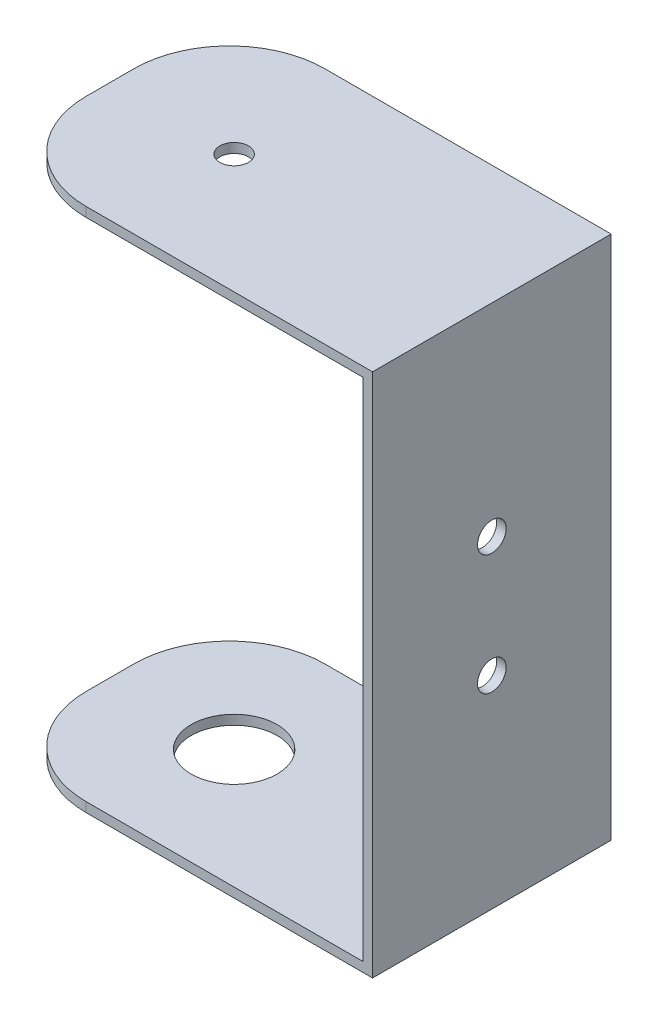
ISO-10303-21;
HEADER;
FILE_DESCRIPTION(('STEP AP214'),'2;1');
FILE_NAME('part.step','',(''),(''),'','','');
FILE_SCHEMA(('AUTOMOTIVE_DESIGN { 1 0 10303 214 1 1 1 1 }'));
ENDSEC;
DATA;
#1=APPLICATION_CONTEXT('core data for automotive mechanical design processes');
#2=APPLICATION_PROTOCOL_DEFINITION('international standard','automotive_design',2000,#1);
#3=PRODUCT_CONTEXT('',#1,'mechanical');
#4=PRODUCT('Part','Part','',(#3));
#5=PRODUCT_RELATED_PRODUCT_CATEGORY('part','',(#4));
#6=PRODUCT_DEFINITION_FORMATION('','',#4);
#7=PRODUCT_DEFINITION_CONTEXT('part definition',#1,'design');
#8=PRODUCT_DEFINITION('design','',#6,#7);
#9=PRODUCT_DEFINITION_SHAPE('','',#8);
#10=(LENGTH_UNIT() NAMED_UNIT(*) SI_UNIT(.MILLI.,.METRE.));
#11=(NAMED_UNIT(*) PLANE_ANGLE_UNIT() SI_UNIT($,.RADIAN.));
#12=(NAMED_UNIT(*) SI_UNIT($,.STERADIAN.) SOLID_ANGLE_UNIT());
#13=UNCERTAINTY_MEASURE_WITH_UNIT(LENGTH_MEASURE(1.E-05),#10,'distance_accuracy_value','');
#14=(GEOMETRIC_REPRESENTATION_CONTEXT(3) GLOBAL_UNCERTAINTY_ASSIGNED_CONTEXT((#13)) GLOBAL_UNIT_ASSIGNED_CONTEXT((#10,
#11,#12)) REPRESENTATION_CONTEXT('',''));
#15=CARTESIAN_POINT('',(0.,0.,0.));
#16=DIRECTION('',(0.,0.,1.));
#17=DIRECTION('',(1.,0.,0.));
#18=AXIS2_PLACEMENT_3D('',#15,#16,#17);
#19=CARTESIAN_POINT('',(0.,18.1492832575977,25.));
#20=DIRECTION('',(0.,-1.,0.));
#21=DIRECTION('',(1.,0.,0.));
#22=AXIS2_PLACEMENT_3D('',#19,#20,#21);
#23=PLANE('',#22);
#24=CARTESIAN_POINT('',(-26.,18.1492832575977,12.5));
#25=DIRECTION('',(0.,1.,0.));
#26=DIRECTION('',(-1.,0.,0.));
#27=AXIS2_PLACEMENT_3D('',#24,#25,#26);
#28=CIRCLE('',#27,1.5);
#29=CARTESIAN_POINT('',(-27.5,18.1492832575977,12.5));
#30=VERTEX_POINT('',#29);
#31=EDGE_CURVE('E272',#30,#30,#28,.T.);
#32=ORIENTED_EDGE('',*,*,#31,.F.);
#33=EDGE_LOOP('',(#32));
#34=FACE_BOUND('',#33,.T.);
#35=DIRECTION('',(0.,0.,-1.));
#36=VECTOR('',#35,1.);
#37=CARTESIAN_POINT('',(-39.,18.1492832575977,25.));
#38=LINE('',#37,#36);
#39=CARTESIAN_POINT('',(-39.,18.1492832575977,15.));
#40=VERTEX_POINT('',#39);
#41=CARTESIAN_POINT('',(-39.,18.1492832575977,10.));
#42=VERTEX_POINT('',#41);
#43=EDGE_CURVE('E183',#40,#42,#38,.T.);
#44=ORIENTED_EDGE('',*,*,#43,.F.);
#45=CARTESIAN_POINT('',(-29.,18.1492832575977,15.));
#46=DIRECTION('',(0.,-1.,0.));
#47=DIRECTION('',(1.,0.,0.));
#48=AXIS2_PLACEMENT_3D('',#45,#46,#47);
#49=CIRCLE('',#48,10.);
#50=CARTESIAN_POINT('',(-29.,18.1492832575977,25.));
#51=VERTEX_POINT('',#50);
#52=EDGE_CURVE('E193',#40,#51,#49,.F.);
#53=ORIENTED_EDGE('',*,*,#52,.T.);
#54=DIRECTION('',(-1.,0.,0.));
#55=VECTOR('',#54,1.);
#56=CARTESIAN_POINT('',(0.,18.1492832575977,25.));
#57=LINE('',#56,#55);
#58=CARTESIAN_POINT('',(1.,18.1492832575977,25.));
#59=VERTEX_POINT('',#58);
#60=EDGE_CURVE('E143',#59,#51,#57,.T.);
#61=ORIENTED_EDGE('',*,*,#60,.F.);
#62=DIRECTION('',(0.,0.,-1.));
#63=VECTOR('',#62,1.);
#64=CARTESIAN_POINT('',(1.,18.1492832575977,25.));
#65=LINE('',#64,#63);
#66=CARTESIAN_POINT('',(1.,18.1492832575977,0.));
#67=VERTEX_POINT('',#66);
#68=EDGE_CURVE('E157',#59,#67,#65,.T.);
#69=ORIENTED_EDGE('',*,*,#68,.T.);
#70=DIRECTION('',(-1.,0.,0.));
#71=VECTOR('',#70,1.);
#72=CARTESIAN_POINT('',(0.,18.1492832575977,0.));
#73=LINE('',#72,#71);
#74=CARTESIAN_POINT('',(-29.,18.1492832575977,0.));
#75=VERTEX_POINT('',#74);
#76=EDGE_CURVE('E158',#67,#75,#73,.T.);
#77=ORIENTED_EDGE('',*,*,#76,.T.);
#78=CARTESIAN_POINT('',(-29.,18.1492832575977,10.));
#79=DIRECTION('',(0.,-1.,0.));
#80=DIRECTION('',(1.,0.,0.));
#81=AXIS2_PLACEMENT_3D('',#78,#79,#80);
#82=CIRCLE('',#81,10.);
#83=EDGE_CURVE('E191',#75,#42,#82,.F.);
#84=ORIENTED_EDGE('',*,*,#83,.T.);
#85=EDGE_LOOP('',(#44,#53,#61,#69,#77,#84));
#86=FACE_BOUND('',#85,.T.);
#87=ADVANCED_FACE('F32',(#34,#86),#23,.F.);
#88=CARTESIAN_POINT('',(-39.,17.1492832575977,25.));
#89=DIRECTION('',(-1.,0.,0.));
#90=DIRECTION('',(0.,0.,1.));
#91=AXIS2_PLACEMENT_3D('',#88,#89,#90);
#92=PLANE('',#91);
#93=DIRECTION('',(0.,0.,-1.));
#94=VECTOR('',#93,1.);
#95=CARTESIAN_POINT('',(-39.,17.1492832575977,25.));
#96=LINE('',#95,#94);
#97=CARTESIAN_POINT('',(-39.,17.1492832575977,15.));
#98=VERTEX_POINT('',#97);
#99=CARTESIAN_POINT('',(-39.,17.1492832575977,10.));
#100=VERTEX_POINT('',#99);
#101=EDGE_CURVE('E132',#98,#100,#96,.T.);
#102=ORIENTED_EDGE('',*,*,#101,.F.);
#103=DIRECTION('',(0.,1.,0.));
#104=VECTOR('',#103,1.);
#105=CARTESIAN_POINT('',(-39.,18.1492832575977,15.));
#106=LINE('',#105,#104);
#107=EDGE_CURVE('E188',#98,#40,#106,.T.);
#108=ORIENTED_EDGE('',*,*,#107,.T.);
#109=ORIENTED_EDGE('',*,*,#43,.T.);
#110=DIRECTION('',(0.,1.,0.));
#111=VECTOR('',#110,1.);
#112=CARTESIAN_POINT('',(-39.,17.1492832575977,10.));
#113=LINE('',#112,#111);
#114=EDGE_CURVE('E186',#42,#100,#113,.F.);
#115=ORIENTED_EDGE('',*,*,#114,.T.);
#116=EDGE_LOOP('',(#102,#108,#109,#115));
#117=FACE_BOUND('',#116,.T.);
#118=ADVANCED_FACE('F245',(#117),#92,.T.);
#119=CARTESIAN_POINT('',(0.,17.1492832575977,25.));
#120=DIRECTION('',(0.,-1.,0.));
#121=DIRECTION('',(1.,0.,0.));
#122=AXIS2_PLACEMENT_3D('',#119,#120,#121);
#123=PLANE('',#122);
#124=CARTESIAN_POINT('',(-26.,17.1492832575977,12.5));
#125=DIRECTION('',(0.,1.,0.));
#126=DIRECTION('',(-1.,0.,0.));
#127=AXIS2_PLACEMENT_3D('',#124,#125,#126);
#128=CIRCLE('',#127,1.5);
#129=CARTESIAN_POINT('',(-27.5,17.1492832575977,12.5));
#130=VERTEX_POINT('',#129);
#131=EDGE_CURVE('E161',#130,#130,#128,.T.);
#132=ORIENTED_EDGE('',*,*,#131,.T.);
#133=EDGE_LOOP('',(#132));
#134=FACE_BOUND('',#133,.T.);
#135=DIRECTION('',(-1.,0.,0.));
#136=VECTOR('',#135,1.);
#137=CARTESIAN_POINT('',(0.,17.1492832575977,25.));
#138=LINE('',#137,#136);
#139=CARTESIAN_POINT('',(0.,17.1492832575977,25.));
#140=VERTEX_POINT('',#139);
#141=CARTESIAN_POINT('',(-29.,17.1492832575977,25.));
#142=VERTEX_POINT('',#141);
#143=EDGE_CURVE('E124',#140,#142,#138,.T.);
#144=ORIENTED_EDGE('',*,*,#143,.T.);
#145=CARTESIAN_POINT('',(-29.,17.1492832575977,15.));
#146=DIRECTION('',(0.,-1.,0.));
#147=DIRECTION('',(1.,0.,0.));
#148=AXIS2_PLACEMENT_3D('',#145,#146,#147);
#149=CIRCLE('',#148,10.);
#150=EDGE_CURVE('E200',#142,#98,#149,.T.);
#151=ORIENTED_EDGE('',*,*,#150,.T.);
#152=ORIENTED_EDGE('',*,*,#101,.T.);
#153=CARTESIAN_POINT('',(-29.,17.1492832575977,10.));
#154=DIRECTION('',(0.,-1.,0.));
#155=DIRECTION('',(1.,0.,0.));
#156=AXIS2_PLACEMENT_3D('',#153,#154,#155);
#157=CIRCLE('',#156,10.);
#158=CARTESIAN_POINT('',(-29.,17.1492832575977,0.));
#159=VERTEX_POINT('',#158);
#160=EDGE_CURVE('E198',#100,#159,#157,.T.);
#161=ORIENTED_EDGE('',*,*,#160,.T.);
#162=DIRECTION('',(-1.,0.,0.));
#163=VECTOR('',#162,1.);
#164=CARTESIAN_POINT('',(0.,17.1492832575977,0.));
#165=LINE('',#164,#163);
#166=CARTESIAN_POINT('',(0.,17.1492832575977,0.));
#167=VERTEX_POINT('',#166);
#168=EDGE_CURVE('E127',#167,#159,#165,.T.);
#169=ORIENTED_EDGE('',*,*,#168,.F.);
#170=DIRECTION('',(0.,0.,-1.));
#171=VECTOR('',#170,1.);
#172=CARTESIAN_POINT('',(0.,17.1492832575977,25.));
#173=LINE('',#172,#171);
#174=EDGE_CURVE('E121',#140,#167,#173,.T.);
#175=ORIENTED_EDGE('',*,*,#174,.F.);
#176=EDGE_LOOP('',(#144,#151,#152,#161,#169,#175));
#177=FACE_BOUND('',#176,.T.);
#178=ADVANCED_FACE('F123',(#134,#177),#123,.T.);
#179=CARTESIAN_POINT('',(0.,17.1492832575977,25.));
#180=DIRECTION('',(-1.,0.,0.));
#181=DIRECTION('',(0.,-1.,0.));
#182=AXIS2_PLACEMENT_3D('',#179,#180,#181);
#183=PLANE('',#182);
#184=CARTESIAN_POINT('',(0.,-3.05071674240226,12.5));
#185=DIRECTION('',(1.,0.,0.));
#186=DIRECTION('',(0.,1.,0.));
#187=AXIS2_PLACEMENT_3D('',#184,#185,#186);
#188=CIRCLE('',#187,1.5);
#189=CARTESIAN_POINT('',(0.,-1.55071674240226,12.5));
#190=VERTEX_POINT('',#189);
#191=EDGE_CURVE('E287',#190,#190,#188,.T.);
#192=ORIENTED_EDGE('',*,*,#191,.T.);
#193=EDGE_LOOP('',(#192));
#194=FACE_BOUND('',#193,.T.);
#195=CARTESIAN_POINT('',(0.,-15.6507167424023,12.5));
#196=DIRECTION('',(1.,0.,0.));
#197=DIRECTION('',(0.,1.,0.));
#198=AXIS2_PLACEMENT_3D('',#195,#196,#197);
#199=CIRCLE('',#198,1.5);
#200=CARTESIAN_POINT('',(0.,-14.1507167424023,12.5));
#201=VERTEX_POINT('',#200);
#202=EDGE_CURVE('E281',#201,#201,#199,.T.);
#203=ORIENTED_EDGE('',*,*,#202,.T.);
#204=EDGE_LOOP('',(#203));
#205=FACE_BOUND('',#204,.T.);
#206=DIRECTION('',(0.,1.,0.));
#207=VECTOR('',#206,1.);
#208=CARTESIAN_POINT('',(0.,17.1492832575977,0.));
#209=LINE('',#208,#207);
#210=CARTESIAN_POINT('',(0.,-35.8507167424023,0.));
#211=VERTEX_POINT('',#210);
#212=EDGE_CURVE('E163',#211,#167,#209,.T.);
#213=ORIENTED_EDGE('',*,*,#212,.F.);
#214=DIRECTION('',(0.,0.,-1.));
#215=VECTOR('',#214,1.);
#216=CARTESIAN_POINT('',(0.,-35.8507167424023,25.));
#217=LINE('',#216,#215);
#218=CARTESIAN_POINT('',(0.,-35.8507167424023,25.));
#219=VERTEX_POINT('',#218);
#220=EDGE_CURVE('E133',#219,#211,#217,.T.);
#221=ORIENTED_EDGE('',*,*,#220,.F.);
#222=DIRECTION('',(0.,1.,0.));
#223=VECTOR('',#222,1.);
#224=CARTESIAN_POINT('',(0.,17.1492832575977,25.));
#225=LINE('',#224,#223);
#226=EDGE_CURVE('E140',#219,#140,#225,.T.);
#227=ORIENTED_EDGE('',*,*,#226,.T.);
#228=ORIENTED_EDGE('',*,*,#174,.T.);
#229=EDGE_LOOP('',(#213,#221,#227,#228));
#230=FACE_BOUND('',#229,.T.);
#231=ADVANCED_FACE('F146',(#194,#205,#230),#183,.T.);
#232=CARTESIAN_POINT('',(0.,-35.8507167424023,25.));
#233=DIRECTION('',(0.,1.,0.));
#234=DIRECTION('',(-1.,0.,0.));
#235=AXIS2_PLACEMENT_3D('',#232,#233,#234);
#236=PLANE('',#235);
#237=CARTESIAN_POINT('',(-26.,-35.8507167424023,12.5));
#238=DIRECTION('',(0.,-1.,0.));
#239=DIRECTION('',(1.,0.,0.));
#240=AXIS2_PLACEMENT_3D('',#237,#238,#239);
#241=CIRCLE('',#240,4.5);
#242=CARTESIAN_POINT('',(-21.5,-35.8507167424023,12.5));
#243=VERTEX_POINT('',#242);
#244=EDGE_CURVE('E275',#243,#243,#241,.T.);
#245=ORIENTED_EDGE('',*,*,#244,.T.);
#246=EDGE_LOOP('',(#245));
#247=FACE_BOUND('',#246,.T.);
#248=DIRECTION('',(1.,0.,0.));
#249=VECTOR('',#248,1.);
#250=CARTESIAN_POINT('',(0.,-35.8507167424023,0.));
#251=LINE('',#250,#249);
#252=CARTESIAN_POINT('',(-29.,-35.8507167424023,0.));
#253=VERTEX_POINT('',#252);
#254=EDGE_CURVE('E165',#253,#211,#251,.T.);
#255=ORIENTED_EDGE('',*,*,#254,.F.);
#256=CARTESIAN_POINT('',(-29.,-35.8507167424023,10.));
#257=DIRECTION('',(0.,1.,0.));
#258=DIRECTION('',(-1.,0.,0.));
#259=AXIS2_PLACEMENT_3D('',#256,#257,#258);
#260=CIRCLE('',#259,10.);
#261=CARTESIAN_POINT('',(-39.,-35.8507167424023,10.));
#262=VERTEX_POINT('',#261);
#263=EDGE_CURVE('E210',#253,#262,#260,.T.);
#264=ORIENTED_EDGE('',*,*,#263,.T.);
#265=DIRECTION('',(0.,0.,-1.));
#266=VECTOR('',#265,1.);
#267=CARTESIAN_POINT('',(-39.,-35.8507167424023,25.));
#268=LINE('',#267,#266);
#269=CARTESIAN_POINT('',(-39.,-35.8507167424023,15.));
#270=VERTEX_POINT('',#269);
#271=EDGE_CURVE('E178',#270,#262,#268,.T.);
#272=ORIENTED_EDGE('',*,*,#271,.F.);
#273=CARTESIAN_POINT('',(-29.,-35.8507167424023,15.));
#274=DIRECTION('',(0.,1.,0.));
#275=DIRECTION('',(-1.,0.,0.));
#276=AXIS2_PLACEMENT_3D('',#273,#274,#275);
#277=CIRCLE('',#276,10.);
#278=CARTESIAN_POINT('',(-29.,-35.8507167424023,25.));
#279=VERTEX_POINT('',#278);
#280=EDGE_CURVE('E208',#270,#279,#277,.T.);
#281=ORIENTED_EDGE('',*,*,#280,.T.);
#282=DIRECTION('',(1.,0.,0.));
#283=VECTOR('',#282,1.);
#284=CARTESIAN_POINT('',(0.,-35.8507167424023,25.));
#285=LINE('',#284,#283);
#286=EDGE_CURVE('E148',#279,#219,#285,.T.);
#287=ORIENTED_EDGE('',*,*,#286,.T.);
#288=ORIENTED_EDGE('',*,*,#220,.T.);
#289=EDGE_LOOP('',(#255,#264,#272,#281,#287,#288));
#290=FACE_BOUND('',#289,.T.);
#291=ADVANCED_FACE('F221',(#247,#290),#236,.T.);
#292=CARTESIAN_POINT('',(-39.,-36.8507167424023,25.));
#293=DIRECTION('',(-1.,0.,0.));
#294=DIRECTION('',(0.,0.,1.));
#295=AXIS2_PLACEMENT_3D('',#292,#293,#294);
#296=PLANE('',#295);
#297=ORIENTED_EDGE('',*,*,#271,.T.);
#298=DIRECTION('',(0.,1.,0.));
#299=VECTOR('',#298,1.);
#300=CARTESIAN_POINT('',(-39.,-36.8507167424023,10.));
#301=LINE('',#300,#299);
#302=CARTESIAN_POINT('',(-39.,-36.8507167424023,10.));
#303=VERTEX_POINT('',#302);
#304=EDGE_CURVE('E47',#262,#303,#301,.F.);
#305=ORIENTED_EDGE('',*,*,#304,.T.);
#306=DIRECTION('',(0.,0.,-1.));
#307=VECTOR('',#306,1.);
#308=CARTESIAN_POINT('',(-39.,-36.8507167424023,25.));
#309=LINE('',#308,#307);
#310=CARTESIAN_POINT('',(-39.,-36.8507167424023,15.));
#311=VERTEX_POINT('',#310);
#312=EDGE_CURVE('E176',#311,#303,#309,.T.);
#313=ORIENTED_EDGE('',*,*,#312,.F.);
#314=DIRECTION('',(0.,1.,0.));
#315=VECTOR('',#314,1.);
#316=CARTESIAN_POINT('',(-39.,-35.8507167424023,15.));
#317=LINE('',#316,#315);
#318=EDGE_CURVE('E212',#311,#270,#317,.T.);
#319=ORIENTED_EDGE('',*,*,#318,.T.);
#320=EDGE_LOOP('',(#297,#305,#313,#319));
#321=FACE_BOUND('',#320,.T.);
#322=ADVANCED_FACE('F217',(#321),#296,.T.);
#323=CARTESIAN_POINT('',(0.,-36.8507167424023,25.));
#324=DIRECTION('',(0.,1.,0.));
#325=DIRECTION('',(-1.,0.,0.));
#326=AXIS2_PLACEMENT_3D('',#323,#324,#325);
#327=PLANE('',#326);
#328=CARTESIAN_POINT('',(-26.,-36.8507167424023,12.5));
#329=DIRECTION('',(0.,-1.,0.));
#330=DIRECTION('',(1.,0.,0.));
#331=AXIS2_PLACEMENT_3D('',#328,#329,#330);
#332=CIRCLE('',#331,4.5);
#333=CARTESIAN_POINT('',(-21.5,-36.8507167424023,12.5));
#334=VERTEX_POINT('',#333);
#335=EDGE_CURVE('E278',#334,#334,#332,.T.);
#336=ORIENTED_EDGE('',*,*,#335,.F.);
#337=EDGE_LOOP('',(#336));
#338=FACE_BOUND('',#337,.T.);
#339=ORIENTED_EDGE('',*,*,#312,.T.);
#340=CARTESIAN_POINT('',(-29.,-36.8507167424023,10.));
#341=DIRECTION('',(0.,1.,0.));
#342=DIRECTION('',(-1.,0.,0.));
#343=AXIS2_PLACEMENT_3D('',#340,#341,#342);
#344=CIRCLE('',#343,10.);
#345=CARTESIAN_POINT('',(-29.,-36.8507167424023,0.));
#346=VERTEX_POINT('',#345);
#347=EDGE_CURVE('E11',#303,#346,#344,.F.);
#348=ORIENTED_EDGE('',*,*,#347,.T.);
#349=DIRECTION('',(1.,0.,0.));
#350=VECTOR('',#349,1.);
#351=CARTESIAN_POINT('',(0.,-36.8507167424023,0.));
#352=LINE('',#351,#350);
#353=CARTESIAN_POINT('',(1.,-36.8507167424023,0.));
#354=VERTEX_POINT('',#353);
#355=EDGE_CURVE('E167',#346,#354,#352,.T.);
#356=ORIENTED_EDGE('',*,*,#355,.T.);
#357=DIRECTION('',(0.,0.,-1.));
#358=VECTOR('',#357,1.);
#359=CARTESIAN_POINT('',(1.,-36.8507167424023,25.));
#360=LINE('',#359,#358);
#361=CARTESIAN_POINT('',(1.,-36.8507167424023,25.));
#362=VERTEX_POINT('',#361);
#363=EDGE_CURVE('E173',#362,#354,#360,.T.);
#364=ORIENTED_EDGE('',*,*,#363,.F.);
#365=DIRECTION('',(1.,0.,0.));
#366=VECTOR('',#365,1.);
#367=CARTESIAN_POINT('',(0.,-36.8507167424023,25.));
#368=LINE('',#367,#366);
#369=CARTESIAN_POINT('',(-29.,-36.8507167424023,25.));
#370=VERTEX_POINT('',#369);
#371=EDGE_CURVE('E150',#370,#362,#368,.T.);
#372=ORIENTED_EDGE('',*,*,#371,.F.);
#373=CARTESIAN_POINT('',(-29.,-36.8507167424023,15.));
#374=DIRECTION('',(0.,1.,0.));
#375=DIRECTION('',(-1.,0.,0.));
#376=AXIS2_PLACEMENT_3D('',#373,#374,#375);
#377=CIRCLE('',#376,10.);
#378=EDGE_CURVE('E40',#370,#311,#377,.F.);
#379=ORIENTED_EDGE('',*,*,#378,.T.);
#380=EDGE_LOOP('',(#339,#348,#356,#364,#372,#379));
#381=FACE_BOUND('',#380,.T.);
#382=ADVANCED_FACE('F232',(#338,#381),#327,.F.);
#383=CARTESIAN_POINT('',(1.,17.1492832575977,25.));
#384=DIRECTION('',(-1.,0.,0.));
#385=DIRECTION('',(0.,-1.,0.));
#386=AXIS2_PLACEMENT_3D('',#383,#384,#385);
#387=PLANE('',#386);
#388=CARTESIAN_POINT('',(1.,-3.05071674240226,12.5));
#389=DIRECTION('',(1.,0.,0.));
#390=DIRECTION('',(0.,1.,0.));
#391=AXIS2_PLACEMENT_3D('',#388,#389,#390);
#392=CIRCLE('',#391,1.5);
#393=CARTESIAN_POINT('',(1.,-1.55071674240226,12.5));
#394=VERTEX_POINT('',#393);
#395=EDGE_CURVE('E290',#394,#394,#392,.T.);
#396=ORIENTED_EDGE('',*,*,#395,.F.);
#397=EDGE_LOOP('',(#396));
#398=FACE_BOUND('',#397,.T.);
#399=CARTESIAN_POINT('',(1.,-15.6507167424023,12.5));
#400=DIRECTION('',(1.,0.,0.));
#401=DIRECTION('',(0.,1.,0.));
#402=AXIS2_PLACEMENT_3D('',#399,#400,#401);
#403=CIRCLE('',#402,1.5);
#404=CARTESIAN_POINT('',(1.,-14.1507167424023,12.5));
#405=VERTEX_POINT('',#404);
#406=EDGE_CURVE('E284',#405,#405,#403,.T.);
#407=ORIENTED_EDGE('',*,*,#406,.F.);
#408=EDGE_LOOP('',(#407));
#409=FACE_BOUND('',#408,.T.);
#410=DIRECTION('',(0.,1.,0.));
#411=VECTOR('',#410,1.);
#412=CARTESIAN_POINT('',(1.,17.1492832575977,0.));
#413=LINE('',#412,#411);
#414=EDGE_CURVE('E169',#354,#67,#413,.T.);
#415=ORIENTED_EDGE('',*,*,#414,.T.);
#416=ORIENTED_EDGE('',*,*,#68,.F.);
#417=DIRECTION('',(0.,1.,0.));
#418=VECTOR('',#417,1.);
#419=CARTESIAN_POINT('',(1.,17.1492832575977,25.));
#420=LINE('',#419,#418);
#421=EDGE_CURVE('E155',#362,#59,#420,.T.);
#422=ORIENTED_EDGE('',*,*,#421,.F.);
#423=ORIENTED_EDGE('',*,*,#363,.T.);
#424=EDGE_LOOP('',(#415,#416,#422,#423));
#425=FACE_BOUND('',#424,.T.);
#426=ADVANCED_FACE('F235',(#398,#409,#425),#387,.F.);
#427=CARTESIAN_POINT('',(0.,0.,25.));
#428=DIRECTION('',(0.,0.,-1.));
#429=DIRECTION('',(-1.,0.,0.));
#430=AXIS2_PLACEMENT_3D('',#427,#428,#429);
#431=PLANE('',#430);
#432=ORIENTED_EDGE('',*,*,#60,.T.);
#433=DIRECTION('',(0.,1.,0.));
#434=VECTOR('',#433,1.);
#435=CARTESIAN_POINT('',(-29.,17.1492832575977,25.));
#436=LINE('',#435,#434);
#437=EDGE_CURVE('E142',#51,#142,#436,.F.);
#438=ORIENTED_EDGE('',*,*,#437,.T.);
#439=ORIENTED_EDGE('',*,*,#143,.F.);
#440=ORIENTED_EDGE('',*,*,#226,.F.);
#441=ORIENTED_EDGE('',*,*,#286,.F.);
#442=DIRECTION('',(0.,1.,0.));
#443=VECTOR('',#442,1.);
#444=CARTESIAN_POINT('',(-29.,-36.8507167424023,25.));
#445=LINE('',#444,#443);
#446=EDGE_CURVE('E195',#279,#370,#445,.F.);
#447=ORIENTED_EDGE('',*,*,#446,.T.);
#448=ORIENTED_EDGE('',*,*,#371,.T.);
#449=ORIENTED_EDGE('',*,*,#421,.T.);
#450=EDGE_LOOP('',(#432,#438,#439,#440,#441,#447,#448,#449));
#451=FACE_BOUND('',#450,.T.);
#452=ADVANCED_FACE('F138',(#451),#431,.F.);
#453=CARTESIAN_POINT('',(0.,0.,0.));
#454=DIRECTION('',(0.,0.,-1.));
#455=DIRECTION('',(-1.,0.,0.));
#456=AXIS2_PLACEMENT_3D('',#453,#454,#455);
#457=PLANE('',#456);
#458=ORIENTED_EDGE('',*,*,#168,.T.);
#459=DIRECTION('',(0.,1.,0.));
#460=VECTOR('',#459,1.);
#461=CARTESIAN_POINT('',(-29.,0.,0.));
#462=LINE('',#461,#460);
#463=EDGE_CURVE('E205',#159,#75,#462,.T.);
#464=ORIENTED_EDGE('',*,*,#463,.T.);
#465=ORIENTED_EDGE('',*,*,#76,.F.);
#466=ORIENTED_EDGE('',*,*,#414,.F.);
#467=ORIENTED_EDGE('',*,*,#355,.F.);
#468=DIRECTION('',(0.,1.,0.));
#469=VECTOR('',#468,1.);
#470=CARTESIAN_POINT('',(-29.,0.,0.));
#471=LINE('',#470,#469);
#472=EDGE_CURVE('E202',#346,#253,#471,.T.);
#473=ORIENTED_EDGE('',*,*,#472,.T.);
#474=ORIENTED_EDGE('',*,*,#254,.T.);
#475=ORIENTED_EDGE('',*,*,#212,.T.);
#476=EDGE_LOOP('',(#458,#464,#465,#466,#467,#473,#474,#475));
#477=FACE_BOUND('',#476,.T.);
#478=ADVANCED_FACE('F228',(#477),#457,.T.);
#479=CARTESIAN_POINT('',(-26.,17.1492832575977,12.5));
#480=DIRECTION('',(0.,1.,0.));
#481=DIRECTION('',(-1.,0.,0.));
#482=AXIS2_PLACEMENT_3D('',#479,#480,#481);
#483=CYLINDRICAL_SURFACE('',#482,1.5);
#484=ORIENTED_EDGE('',*,*,#131,.F.);
#485=EDGE_LOOP('',(#484));
#486=FACE_BOUND('',#485,.T.);
#487=ORIENTED_EDGE('',*,*,#31,.T.);
#488=EDGE_LOOP('',(#487));
#489=FACE_BOUND('',#488,.T.);
#490=ADVANCED_FACE('F316',(#486,#489),#483,.F.);
#491=CARTESIAN_POINT('',(-26.,-35.8507167424023,12.5));
#492=DIRECTION('',(0.,-1.,0.));
#493=DIRECTION('',(1.,0.,0.));
#494=AXIS2_PLACEMENT_3D('',#491,#492,#493);
#495=CYLINDRICAL_SURFACE('',#494,4.5);
#496=ORIENTED_EDGE('',*,*,#244,.F.);
#497=EDGE_LOOP('',(#496));
#498=FACE_BOUND('',#497,.T.);
#499=ORIENTED_EDGE('',*,*,#335,.T.);
#500=EDGE_LOOP('',(#499));
#501=FACE_BOUND('',#500,.T.);
#502=ADVANCED_FACE('F310',(#498,#501),#495,.F.);
#503=CARTESIAN_POINT('',(0.,-15.6507167424023,12.5));
#504=DIRECTION('',(1.,0.,0.));
#505=DIRECTION('',(0.,1.,0.));
#506=AXIS2_PLACEMENT_3D('',#503,#504,#505);
#507=CYLINDRICAL_SURFACE('',#506,1.5);
#508=ORIENTED_EDGE('',*,*,#202,.F.);
#509=EDGE_LOOP('',(#508));
#510=FACE_BOUND('',#509,.T.);
#511=ORIENTED_EDGE('',*,*,#406,.T.);
#512=EDGE_LOOP('',(#511));
#513=FACE_BOUND('',#512,.T.);
#514=ADVANCED_FACE('F300',(#510,#513),#507,.F.);
#515=CARTESIAN_POINT('',(0.,-3.05071674240226,12.5));
#516=DIRECTION('',(1.,0.,0.));
#517=DIRECTION('',(0.,1.,0.));
#518=AXIS2_PLACEMENT_3D('',#515,#516,#517);
#519=CYLINDRICAL_SURFACE('',#518,1.5);
#520=ORIENTED_EDGE('',*,*,#191,.F.);
#521=EDGE_LOOP('',(#520));
#522=FACE_BOUND('',#521,.T.);
#523=ORIENTED_EDGE('',*,*,#395,.T.);
#524=EDGE_LOOP('',(#523));
#525=FACE_BOUND('',#524,.T.);
#526=ADVANCED_FACE('F260',(#522,#525),#519,.F.);
#527=CARTESIAN_POINT('',(-29.,17.1492832575977,15.));
#528=DIRECTION('',(0.,-1.,0.));
#529=DIRECTION('',(0.,0.,-1.));
#530=AXIS2_PLACEMENT_3D('',#527,#528,#529);
#531=CYLINDRICAL_SURFACE('',#530,10.);
#532=ORIENTED_EDGE('',*,*,#150,.F.);
#533=ORIENTED_EDGE('',*,*,#437,.F.);
#534=ORIENTED_EDGE('',*,*,#52,.F.);
#535=ORIENTED_EDGE('',*,*,#107,.F.);
#536=EDGE_LOOP('',(#532,#533,#534,#535));
#537=FACE_BOUND('',#536,.T.);
#538=ADVANCED_FACE('F257',(#537),#531,.T.);
#539=CARTESIAN_POINT('',(-29.,0.,10.));
#540=DIRECTION('',(0.,1.,0.));
#541=DIRECTION('',(0.,0.,1.));
#542=AXIS2_PLACEMENT_3D('',#539,#540,#541);
#543=CYLINDRICAL_SURFACE('',#542,10.);
#544=ORIENTED_EDGE('',*,*,#160,.F.);
#545=ORIENTED_EDGE('',*,*,#114,.F.);
#546=ORIENTED_EDGE('',*,*,#83,.F.);
#547=ORIENTED_EDGE('',*,*,#463,.F.);
#548=EDGE_LOOP('',(#544,#545,#546,#547));
#549=FACE_BOUND('',#548,.T.);
#550=ADVANCED_FACE('F243',(#549),#543,.T.);
#551=CARTESIAN_POINT('',(-29.,0.,10.));
#552=DIRECTION('',(0.,1.,0.));
#553=DIRECTION('',(0.,0.,1.));
#554=AXIS2_PLACEMENT_3D('',#551,#552,#553);
#555=CYLINDRICAL_SURFACE('',#554,10.);
#556=ORIENTED_EDGE('',*,*,#347,.F.);
#557=ORIENTED_EDGE('',*,*,#304,.F.);
#558=ORIENTED_EDGE('',*,*,#263,.F.);
#559=ORIENTED_EDGE('',*,*,#472,.F.);
#560=EDGE_LOOP('',(#556,#557,#558,#559));
#561=FACE_BOUND('',#560,.T.);
#562=ADVANCED_FACE('F225',(#561),#555,.T.);
#563=CARTESIAN_POINT('',(-29.,-36.8507167424023,15.));
#564=DIRECTION('',(0.,-1.,0.));
#565=DIRECTION('',(0.,0.,-1.));
#566=AXIS2_PLACEMENT_3D('',#563,#564,#565);
#567=CYLINDRICAL_SURFACE('',#566,10.);
#568=ORIENTED_EDGE('',*,*,#378,.F.);
#569=ORIENTED_EDGE('',*,*,#446,.F.);
#570=ORIENTED_EDGE('',*,*,#280,.F.);
#571=ORIENTED_EDGE('',*,*,#318,.F.);
#572=EDGE_LOOP('',(#568,#569,#570,#571));
#573=FACE_BOUND('',#572,.T.);
#574=ADVANCED_FACE('F34',(#573),#567,.T.);
#575=CLOSED_SHELL('',(#87,#118,#178,#231,#291,#322,#382,#426,#452,#478,#490,#502,#514,#526,#538,
#550,#562,#574));
#576=MANIFOLD_SOLID_BREP('B2',#575);
#577=ADVANCED_BREP_SHAPE_REPRESENTATION('',(#18,#576),#14);
#578=SHAPE_DEFINITION_REPRESENTATION(#9,#577);
ENDSEC;
END-ISO-10303-21;
